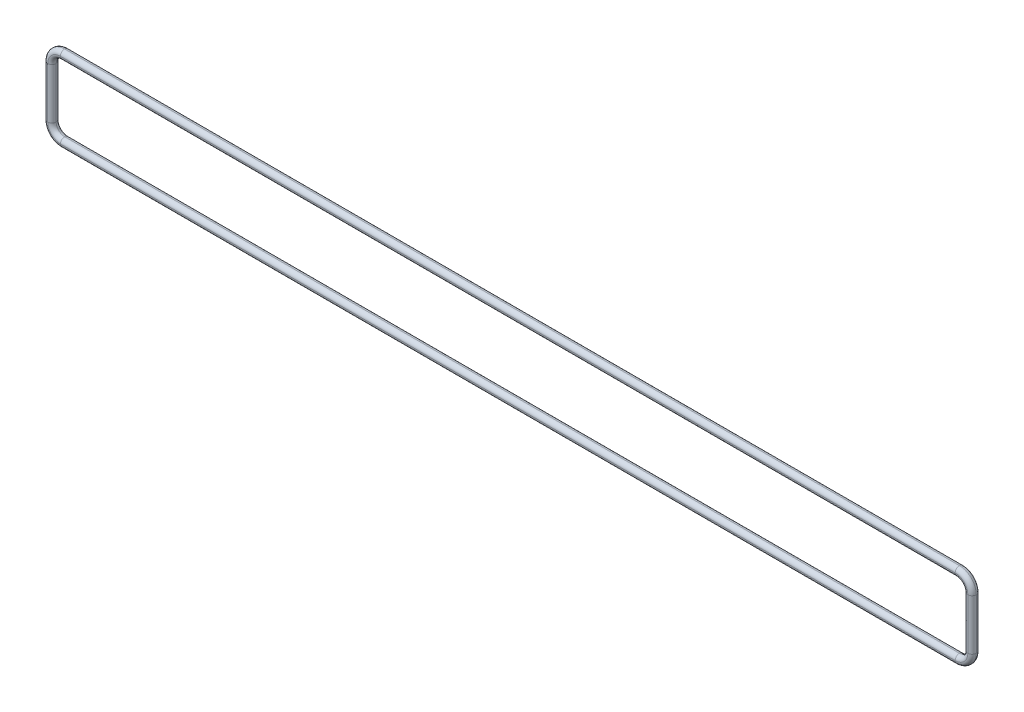
ISO-10303-21;
HEADER;
FILE_DESCRIPTION(('STEP AP214'),'2;1');
FILE_NAME('part.step','',(''),(''),'','','');
FILE_SCHEMA(('AUTOMOTIVE_DESIGN { 1 0 10303 214 1 1 1 1 }'));
ENDSEC;
DATA;
#1=APPLICATION_CONTEXT('core data for automotive mechanical design processes');
#2=APPLICATION_PROTOCOL_DEFINITION('international standard','automotive_design',2000,#1);
#3=PRODUCT_CONTEXT('',#1,'mechanical');
#4=PRODUCT('Part','Part','',(#3));
#5=PRODUCT_RELATED_PRODUCT_CATEGORY('part','',(#4));
#6=PRODUCT_DEFINITION_FORMATION('','',#4);
#7=PRODUCT_DEFINITION_CONTEXT('part definition',#1,'design');
#8=PRODUCT_DEFINITION('design','',#6,#7);
#9=PRODUCT_DEFINITION_SHAPE('','',#8);
#10=(LENGTH_UNIT() NAMED_UNIT(*) SI_UNIT(.MILLI.,.METRE.));
#11=(NAMED_UNIT(*) PLANE_ANGLE_UNIT() SI_UNIT($,.RADIAN.));
#12=(NAMED_UNIT(*) SI_UNIT($,.STERADIAN.) SOLID_ANGLE_UNIT());
#13=UNCERTAINTY_MEASURE_WITH_UNIT(LENGTH_MEASURE(1.E-05),#10,'distance_accuracy_value','');
#14=(GEOMETRIC_REPRESENTATION_CONTEXT(3) GLOBAL_UNCERTAINTY_ASSIGNED_CONTEXT((#13)) GLOBAL_UNIT_ASSIGNED_CONTEXT((#10,
#11,#12)) REPRESENTATION_CONTEXT('',''));
#15=CARTESIAN_POINT('',(0.,0.,0.));
#16=DIRECTION('',(0.,0.,1.));
#17=DIRECTION('',(1.,0.,0.));
#18=AXIS2_PLACEMENT_3D('',#15,#16,#17);
#19=CARTESIAN_POINT('',(695.325,0.,3.175));
#20=DIRECTION('',(0.,-1.,0.));
#21=DIRECTION('',(0.,0.,-1.));
#22=AXIS2_PLACEMENT_3D('',#19,#20,#21);
#23=CYLINDRICAL_SURFACE('',#22,3.175);
#24=CARTESIAN_POINT('',(695.325,38.1,3.175));
#25=DIRECTION('',(0.,1.,0.));
#26=DIRECTION('',(0.,0.,1.));
#27=AXIS2_PLACEMENT_3D('',#24,#25,#26);
#28=CIRCLE('',#27,3.175);
#29=CARTESIAN_POINT('',(695.325,38.1,0.));
#30=VERTEX_POINT('',#29);
#31=CARTESIAN_POINT('',(692.15,38.1,3.175));
#32=VERTEX_POINT('',#31);
#33=EDGE_CURVE('E11',#30,#32,#28,.T.);
#34=ORIENTED_EDGE('',*,*,#33,.F.);
#35=DIRECTION('',(0.,1.,0.));
#36=VECTOR('',#35,1.);
#37=CARTESIAN_POINT('',(695.325,38.1,0.));
#38=LINE('',#37,#36);
#39=CARTESIAN_POINT('',(695.325,0.,0.));
#40=VERTEX_POINT('',#39);
#41=EDGE_CURVE('E335',#40,#30,#38,.T.);
#42=ORIENTED_EDGE('',*,*,#41,.F.);
#43=CARTESIAN_POINT('',(695.325,0.,3.175));
#44=DIRECTION('',(0.,-1.,0.));
#45=DIRECTION('',(0.,0.,-1.));
#46=AXIS2_PLACEMENT_3D('',#43,#44,#45);
#47=CIRCLE('',#46,3.175);
#48=CARTESIAN_POINT('',(692.15,0.,3.175));
#49=VERTEX_POINT('',#48);
#50=EDGE_CURVE('E332',#49,#40,#47,.T.);
#51=ORIENTED_EDGE('',*,*,#50,.F.);
#52=DIRECTION('',(0.,1.,0.));
#53=VECTOR('',#52,1.);
#54=CARTESIAN_POINT('',(692.15,0.,3.175));
#55=LINE('',#54,#53);
#56=EDGE_CURVE('E44',#32,#49,#55,.F.);
#57=ORIENTED_EDGE('',*,*,#56,.F.);
#58=EDGE_LOOP('',(#34,#42,#51,#57));
#59=FACE_BOUND('',#58,.T.);
#60=ADVANCED_FACE('F37',(#59),#23,.T.);
#61=CARTESIAN_POINT('',(685.8,38.1,3.175));
#62=DIRECTION('',(0.,0.,1.));
#63=DIRECTION('',(1.,0.,0.));
#64=AXIS2_PLACEMENT_3D('',#61,#62,#63);
#65=TOROIDAL_SURFACE('',#64,9.52499999999993,3.175);
#66=CARTESIAN_POINT('',(685.8,38.1,0.));
#67=DIRECTION('',(0.,0.,1.));
#68=DIRECTION('',(1.,0.,0.));
#69=AXIS2_PLACEMENT_3D('',#66,#67,#68);
#70=CIRCLE('',#69,9.52499999999993);
#71=CARTESIAN_POINT('',(685.8,47.625,0.));
#72=VERTEX_POINT('',#71);
#73=EDGE_CURVE('E330',#30,#72,#70,.T.);
#74=ORIENTED_EDGE('',*,*,#73,.F.);
#75=ORIENTED_EDGE('',*,*,#33,.T.);
#76=CARTESIAN_POINT('',(685.8,38.1,3.175));
#77=DIRECTION('',(0.,0.,1.));
#78=DIRECTION('',(1.,0.,0.));
#79=AXIS2_PLACEMENT_3D('',#76,#77,#78);
#80=CIRCLE('',#79,6.34999999999993);
#81=CARTESIAN_POINT('',(685.8,44.45,3.175));
#82=VERTEX_POINT('',#81);
#83=EDGE_CURVE('E322',#82,#32,#80,.F.);
#84=ORIENTED_EDGE('',*,*,#83,.F.);
#85=CARTESIAN_POINT('',(685.8,47.6249999999999,3.175));
#86=DIRECTION('',(-1.,0.,0.));
#87=DIRECTION('',(0.,0.,1.));
#88=AXIS2_PLACEMENT_3D('',#85,#86,#87);
#89=CIRCLE('',#88,3.175);
#90=EDGE_CURVE('E319',#72,#82,#89,.T.);
#91=ORIENTED_EDGE('',*,*,#90,.F.);
#92=EDGE_LOOP('',(#74,#75,#84,#91));
#93=FACE_BOUND('',#92,.T.);
#94=ADVANCED_FACE('F422',(#93),#65,.T.);
#95=CARTESIAN_POINT('',(695.325,38.1,3.175));
#96=DIRECTION('',(0.,1.,0.));
#97=DIRECTION('',(0.,0.,1.));
#98=AXIS2_PLACEMENT_3D('',#95,#96,#97);
#99=CYLINDRICAL_SURFACE('',#98,3.175);
#100=CARTESIAN_POINT('',(695.325,38.1,3.175));
#101=DIRECTION('',(0.,1.,0.));
#102=DIRECTION('',(0.,0.,1.));
#103=AXIS2_PLACEMENT_3D('',#100,#101,#102);
#104=CIRCLE('',#103,3.175);
#105=CARTESIAN_POINT('',(695.325,38.1,6.35));
#106=VERTEX_POINT('',#105);
#107=EDGE_CURVE('E325',#32,#106,#104,.T.);
#108=ORIENTED_EDGE('',*,*,#107,.F.);
#109=ORIENTED_EDGE('',*,*,#56,.T.);
#110=CARTESIAN_POINT('',(695.325,0.,3.175));
#111=DIRECTION('',(0.,-1.,0.));
#112=DIRECTION('',(0.,0.,-1.));
#113=AXIS2_PLACEMENT_3D('',#110,#111,#112);
#114=CIRCLE('',#113,3.175);
#115=CARTESIAN_POINT('',(695.325,0.,6.35));
#116=VERTEX_POINT('',#115);
#117=EDGE_CURVE('E314',#116,#49,#114,.T.);
#118=ORIENTED_EDGE('',*,*,#117,.F.);
#119=DIRECTION('',(0.,1.,0.));
#120=VECTOR('',#119,1.);
#121=CARTESIAN_POINT('',(695.325,0.,6.35));
#122=LINE('',#121,#120);
#123=EDGE_CURVE('E311',#106,#116,#122,.F.);
#124=ORIENTED_EDGE('',*,*,#123,.F.);
#125=EDGE_LOOP('',(#108,#109,#118,#124));
#126=FACE_BOUND('',#125,.T.);
#127=ADVANCED_FACE('F339',(#126),#99,.T.);
#128=CARTESIAN_POINT('',(695.325,0.,3.175));
#129=DIRECTION('',(0.,1.,0.));
#130=DIRECTION('',(0.,0.,1.));
#131=AXIS2_PLACEMENT_3D('',#128,#129,#130);
#132=CYLINDRICAL_SURFACE('',#131,3.175);
#133=CARTESIAN_POINT('',(695.325,0.,3.175));
#134=DIRECTION('',(0.,-1.,0.));
#135=DIRECTION('',(0.,0.,-1.));
#136=AXIS2_PLACEMENT_3D('',#133,#134,#135);
#137=CIRCLE('',#136,3.175);
#138=CARTESIAN_POINT('',(698.5,0.,3.175));
#139=VERTEX_POINT('',#138);
#140=EDGE_CURVE('E305',#40,#139,#137,.T.);
#141=ORIENTED_EDGE('',*,*,#140,.F.);
#142=ORIENTED_EDGE('',*,*,#41,.T.);
#143=CARTESIAN_POINT('',(695.325,38.1,3.175));
#144=DIRECTION('',(0.,1.,0.));
#145=DIRECTION('',(0.,0.,1.));
#146=AXIS2_PLACEMENT_3D('',#143,#144,#145);
#147=CIRCLE('',#146,3.175);
#148=CARTESIAN_POINT('',(698.5,38.1,3.175));
#149=VERTEX_POINT('',#148);
#150=EDGE_CURVE('E327',#149,#30,#147,.T.);
#151=ORIENTED_EDGE('',*,*,#150,.F.);
#152=DIRECTION('',(0.,1.,0.));
#153=VECTOR('',#152,1.);
#154=CARTESIAN_POINT('',(698.5,0.,3.175));
#155=LINE('',#154,#153);
#156=EDGE_CURVE('E308',#139,#149,#155,.T.);
#157=ORIENTED_EDGE('',*,*,#156,.F.);
#158=EDGE_LOOP('',(#141,#142,#151,#157));
#159=FACE_BOUND('',#158,.T.);
#160=ADVANCED_FACE('F429',(#159),#132,.T.);
#161=CARTESIAN_POINT('',(685.8,0.,3.175));
#162=DIRECTION('',(0.,0.,1.));
#163=DIRECTION('',(1.,0.,0.));
#164=AXIS2_PLACEMENT_3D('',#161,#162,#163);
#165=TOROIDAL_SURFACE('',#164,9.52499999999993,3.175);
#166=CARTESIAN_POINT('',(685.8,0.,3.175));
#167=DIRECTION('',(0.,0.,1.));
#168=DIRECTION('',(1.,0.,0.));
#169=AXIS2_PLACEMENT_3D('',#166,#167,#168);
#170=CIRCLE('',#169,6.34999999999993);
#171=CARTESIAN_POINT('',(685.8,-6.35,3.175));
#172=VERTEX_POINT('',#171);
#173=EDGE_CURVE('E317',#49,#172,#170,.F.);
#174=ORIENTED_EDGE('',*,*,#173,.F.);
#175=ORIENTED_EDGE('',*,*,#50,.T.);
#176=CARTESIAN_POINT('',(685.8,0.,0.));
#177=DIRECTION('',(0.,0.,1.));
#178=DIRECTION('',(1.,0.,0.));
#179=AXIS2_PLACEMENT_3D('',#176,#177,#178);
#180=CIRCLE('',#179,9.52499999999993);
#181=CARTESIAN_POINT('',(685.8,-9.525,0.));
#182=VERTEX_POINT('',#181);
#183=EDGE_CURVE('E302',#182,#40,#180,.T.);
#184=ORIENTED_EDGE('',*,*,#183,.F.);
#185=CARTESIAN_POINT('',(685.8,-9.52499999999993,3.175));
#186=DIRECTION('',(-1.,0.,0.));
#187=DIRECTION('',(0.,0.,1.));
#188=AXIS2_PLACEMENT_3D('',#185,#186,#187);
#189=CIRCLE('',#188,3.175);
#190=EDGE_CURVE('E299',#172,#182,#189,.T.);
#191=ORIENTED_EDGE('',*,*,#190,.F.);
#192=EDGE_LOOP('',(#174,#175,#184,#191));
#193=FACE_BOUND('',#192,.T.);
#194=ADVANCED_FACE('F345',(#193),#165,.T.);
#195=CARTESIAN_POINT('',(685.8,38.1,3.175));
#196=DIRECTION('',(0.,0.,1.));
#197=DIRECTION('',(1.,0.,0.));
#198=AXIS2_PLACEMENT_3D('',#195,#196,#197);
#199=TOROIDAL_SURFACE('',#198,9.52499999999997,3.175);
#200=ORIENTED_EDGE('',*,*,#150,.T.);
#201=ORIENTED_EDGE('',*,*,#73,.T.);
#202=CARTESIAN_POINT('',(685.8,47.625,3.175));
#203=DIRECTION('',(-1.,0.,0.));
#204=DIRECTION('',(0.,0.,1.));
#205=AXIS2_PLACEMENT_3D('',#202,#203,#204);
#206=CIRCLE('',#205,3.175);
#207=CARTESIAN_POINT('',(685.8,50.8,3.175));
#208=VERTEX_POINT('',#207);
#209=EDGE_CURVE('E294',#208,#72,#206,.T.);
#210=ORIENTED_EDGE('',*,*,#209,.F.);
#211=CARTESIAN_POINT('',(685.8,38.1,3.175));
#212=DIRECTION('',(0.,0.,1.));
#213=DIRECTION('',(1.,0.,0.));
#214=AXIS2_PLACEMENT_3D('',#211,#212,#213);
#215=CIRCLE('',#214,12.7);
#216=EDGE_CURVE('E291',#149,#208,#215,.T.);
#217=ORIENTED_EDGE('',*,*,#216,.F.);
#218=EDGE_LOOP('',(#200,#201,#210,#217));
#219=FACE_BOUND('',#218,.T.);
#220=ADVANCED_FACE('F437',(#219),#199,.T.);
#221=CARTESIAN_POINT('',(685.8,38.1,3.175));
#222=DIRECTION('',(0.,0.,1.));
#223=DIRECTION('',(1.,0.,0.));
#224=AXIS2_PLACEMENT_3D('',#221,#222,#223);
#225=TOROIDAL_SURFACE('',#224,9.52499999999993,3.175);
#226=ORIENTED_EDGE('',*,*,#83,.T.);
#227=ORIENTED_EDGE('',*,*,#107,.T.);
#228=CARTESIAN_POINT('',(685.8,38.1,6.35));
#229=DIRECTION('',(0.,0.,1.));
#230=DIRECTION('',(1.,0.,0.));
#231=AXIS2_PLACEMENT_3D('',#228,#229,#230);
#232=CIRCLE('',#231,9.52499999999993);
#233=CARTESIAN_POINT('',(685.8,47.625,6.35));
#234=VERTEX_POINT('',#233);
#235=EDGE_CURVE('E285',#234,#106,#232,.F.);
#236=ORIENTED_EDGE('',*,*,#235,.F.);
#237=CARTESIAN_POINT('',(685.8,47.6249999999999,3.175));
#238=DIRECTION('',(-1.,0.,0.));
#239=DIRECTION('',(0.,0.,1.));
#240=AXIS2_PLACEMENT_3D('',#237,#238,#239);
#241=CIRCLE('',#240,3.175);
#242=EDGE_CURVE('E282',#82,#234,#241,.T.);
#243=ORIENTED_EDGE('',*,*,#242,.F.);
#244=EDGE_LOOP('',(#226,#227,#236,#243));
#245=FACE_BOUND('',#244,.T.);
#246=ADVANCED_FACE('F364',(#245),#225,.T.);
#247=CARTESIAN_POINT('',(12.7,47.625,3.175));
#248=DIRECTION('',(1.,0.,0.));
#249=DIRECTION('',(0.,0.,-1.));
#250=AXIS2_PLACEMENT_3D('',#247,#248,#249);
#251=CYLINDRICAL_SURFACE('',#250,3.175);
#252=DIRECTION('',(-1.,0.,0.));
#253=VECTOR('',#252,1.);
#254=CARTESIAN_POINT('',(12.7,47.625,0.));
#255=LINE('',#254,#253);
#256=CARTESIAN_POINT('',(12.7,47.625,0.));
#257=VERTEX_POINT('',#256);
#258=EDGE_CURVE('E297',#72,#257,#255,.T.);
#259=ORIENTED_EDGE('',*,*,#258,.F.);
#260=ORIENTED_EDGE('',*,*,#90,.T.);
#261=DIRECTION('',(-1.,0.,0.));
#262=VECTOR('',#261,1.);
#263=CARTESIAN_POINT('',(685.8,44.45,3.175));
#264=LINE('',#263,#262);
#265=CARTESIAN_POINT('',(12.7,44.45,3.175));
#266=VERTEX_POINT('',#265);
#267=EDGE_CURVE('E279',#266,#82,#264,.F.);
#268=ORIENTED_EDGE('',*,*,#267,.F.);
#269=CARTESIAN_POINT('',(12.7,47.625,3.175));
#270=DIRECTION('',(-1.,0.,0.));
#271=DIRECTION('',(0.,0.,1.));
#272=AXIS2_PLACEMENT_3D('',#269,#270,#271);
#273=CIRCLE('',#272,3.175);
#274=EDGE_CURVE('E276',#257,#266,#273,.T.);
#275=ORIENTED_EDGE('',*,*,#274,.F.);
#276=EDGE_LOOP('',(#259,#260,#268,#275));
#277=FACE_BOUND('',#276,.T.);
#278=ADVANCED_FACE('F371',(#277),#251,.T.);
#279=CARTESIAN_POINT('',(685.8,0.,3.175));
#280=DIRECTION('',(0.,0.,1.));
#281=DIRECTION('',(1.,0.,0.));
#282=AXIS2_PLACEMENT_3D('',#279,#280,#281);
#283=TOROIDAL_SURFACE('',#282,9.52499999999993,3.175);
#284=ORIENTED_EDGE('',*,*,#117,.T.);
#285=ORIENTED_EDGE('',*,*,#173,.T.);
#286=CARTESIAN_POINT('',(685.8,-9.52499999999993,3.175));
#287=DIRECTION('',(-1.,0.,0.));
#288=DIRECTION('',(0.,0.,1.));
#289=AXIS2_PLACEMENT_3D('',#286,#287,#288);
#290=CIRCLE('',#289,3.175);
#291=CARTESIAN_POINT('',(685.8,-9.525,6.35));
#292=VERTEX_POINT('',#291);
#293=EDGE_CURVE('E271',#292,#172,#290,.T.);
#294=ORIENTED_EDGE('',*,*,#293,.F.);
#295=CARTESIAN_POINT('',(685.8,0.,6.35));
#296=DIRECTION('',(0.,0.,1.));
#297=DIRECTION('',(1.,0.,0.));
#298=AXIS2_PLACEMENT_3D('',#295,#296,#297);
#299=CIRCLE('',#298,9.52499999999993);
#300=EDGE_CURVE('E268',#116,#292,#299,.F.);
#301=ORIENTED_EDGE('',*,*,#300,.F.);
#302=EDGE_LOOP('',(#284,#285,#294,#301));
#303=FACE_BOUND('',#302,.T.);
#304=ADVANCED_FACE('F349',(#303),#283,.T.);
#305=CARTESIAN_POINT('',(695.325,0.,3.175));
#306=DIRECTION('',(0.,-1.,0.));
#307=DIRECTION('',(0.,0.,-1.));
#308=AXIS2_PLACEMENT_3D('',#305,#306,#307);
#309=CYLINDRICAL_SURFACE('',#308,3.175);
#310=CARTESIAN_POINT('',(695.325,38.1,3.175));
#311=DIRECTION('',(0.,1.,0.));
#312=DIRECTION('',(0.,0.,1.));
#313=AXIS2_PLACEMENT_3D('',#310,#311,#312);
#314=CIRCLE('',#313,3.175);
#315=EDGE_CURVE('E288',#106,#149,#314,.T.);
#316=ORIENTED_EDGE('',*,*,#315,.F.);
#317=ORIENTED_EDGE('',*,*,#123,.T.);
#318=CARTESIAN_POINT('',(695.325,0.,3.175));
#319=DIRECTION('',(0.,-1.,0.));
#320=DIRECTION('',(0.,0.,-1.));
#321=AXIS2_PLACEMENT_3D('',#318,#319,#320);
#322=CIRCLE('',#321,3.175);
#323=EDGE_CURVE('E265',#139,#116,#322,.T.);
#324=ORIENTED_EDGE('',*,*,#323,.F.);
#325=ORIENTED_EDGE('',*,*,#156,.T.);
#326=EDGE_LOOP('',(#316,#317,#324,#325));
#327=FACE_BOUND('',#326,.T.);
#328=ADVANCED_FACE('F357',(#327),#309,.T.);
#329=CARTESIAN_POINT('',(685.8,0.,3.175));
#330=DIRECTION('',(0.,0.,1.));
#331=DIRECTION('',(1.,0.,0.));
#332=AXIS2_PLACEMENT_3D('',#329,#330,#331);
#333=TOROIDAL_SURFACE('',#332,9.52499999999997,3.175);
#334=ORIENTED_EDGE('',*,*,#183,.T.);
#335=ORIENTED_EDGE('',*,*,#140,.T.);
#336=CARTESIAN_POINT('',(685.8,0.,3.175));
#337=DIRECTION('',(0.,0.,1.));
#338=DIRECTION('',(1.,0.,0.));
#339=AXIS2_PLACEMENT_3D('',#336,#337,#338);
#340=CIRCLE('',#339,12.7);
#341=CARTESIAN_POINT('',(685.8,-12.7,3.175));
#342=VERTEX_POINT('',#341);
#343=EDGE_CURVE('E262',#342,#139,#340,.T.);
#344=ORIENTED_EDGE('',*,*,#343,.F.);
#345=CARTESIAN_POINT('',(685.8,-9.52499999999997,3.175));
#346=DIRECTION('',(-1.,0.,0.));
#347=DIRECTION('',(0.,0.,1.));
#348=AXIS2_PLACEMENT_3D('',#345,#346,#347);
#349=CIRCLE('',#348,3.175);
#350=EDGE_CURVE('E259',#182,#342,#349,.T.);
#351=ORIENTED_EDGE('',*,*,#350,.F.);
#352=EDGE_LOOP('',(#334,#335,#344,#351));
#353=FACE_BOUND('',#352,.T.);
#354=ADVANCED_FACE('F449',(#353),#333,.T.);
#355=CARTESIAN_POINT('',(12.7,47.625,3.175));
#356=DIRECTION('',(-1.,0.,0.));
#357=DIRECTION('',(0.,0.,1.));
#358=AXIS2_PLACEMENT_3D('',#355,#356,#357);
#359=CYLINDRICAL_SURFACE('',#358,3.175);
#360=ORIENTED_EDGE('',*,*,#209,.T.);
#361=ORIENTED_EDGE('',*,*,#258,.T.);
#362=CARTESIAN_POINT('',(12.7,47.625,3.175));
#363=DIRECTION('',(-1.,0.,0.));
#364=DIRECTION('',(0.,0.,1.));
#365=AXIS2_PLACEMENT_3D('',#362,#363,#364);
#366=CIRCLE('',#365,3.175);
#367=CARTESIAN_POINT('',(12.7,50.8,3.175));
#368=VERTEX_POINT('',#367);
#369=EDGE_CURVE('E248',#368,#257,#366,.T.);
#370=ORIENTED_EDGE('',*,*,#369,.F.);
#371=DIRECTION('',(-1.,0.,0.));
#372=VECTOR('',#371,1.);
#373=CARTESIAN_POINT('',(12.7,50.8,3.175));
#374=LINE('',#373,#372);
#375=EDGE_CURVE('E245',#208,#368,#374,.T.);
#376=ORIENTED_EDGE('',*,*,#375,.F.);
#377=EDGE_LOOP('',(#360,#361,#370,#376));
#378=FACE_BOUND('',#377,.T.);
#379=ADVANCED_FACE('F383',(#378),#359,.T.);
#380=CARTESIAN_POINT('',(685.8,38.1,3.175));
#381=DIRECTION('',(0.,0.,1.));
#382=DIRECTION('',(1.,0.,0.));
#383=AXIS2_PLACEMENT_3D('',#380,#381,#382);
#384=TOROIDAL_SURFACE('',#383,9.52499999999997,3.175);
#385=ORIENTED_EDGE('',*,*,#315,.T.);
#386=ORIENTED_EDGE('',*,*,#216,.T.);
#387=CARTESIAN_POINT('',(685.8,47.625,3.175));
#388=DIRECTION('',(-1.,0.,0.));
#389=DIRECTION('',(0.,0.,1.));
#390=AXIS2_PLACEMENT_3D('',#387,#388,#389);
#391=CIRCLE('',#390,3.175);
#392=EDGE_CURVE('E242',#234,#208,#391,.T.);
#393=ORIENTED_EDGE('',*,*,#392,.F.);
#394=ORIENTED_EDGE('',*,*,#235,.T.);
#395=EDGE_LOOP('',(#385,#386,#393,#394));
#396=FACE_BOUND('',#395,.T.);
#397=ADVANCED_FACE('F361',(#396),#384,.T.);
#398=CARTESIAN_POINT('',(12.7,47.625,3.175));
#399=DIRECTION('',(-1.,0.,0.));
#400=DIRECTION('',(0.,0.,1.));
#401=AXIS2_PLACEMENT_3D('',#398,#399,#400);
#402=CYLINDRICAL_SURFACE('',#401,3.175);
#403=ORIENTED_EDGE('',*,*,#267,.T.);
#404=ORIENTED_EDGE('',*,*,#242,.T.);
#405=DIRECTION('',(-1.,0.,0.));
#406=VECTOR('',#405,1.);
#407=CARTESIAN_POINT('',(12.7,47.625,6.35));
#408=LINE('',#407,#406);
#409=CARTESIAN_POINT('',(12.7,47.625,6.35));
#410=VERTEX_POINT('',#409);
#411=EDGE_CURVE('E239',#410,#234,#408,.F.);
#412=ORIENTED_EDGE('',*,*,#411,.F.);
#413=CARTESIAN_POINT('',(12.7,47.625,3.175));
#414=DIRECTION('',(-1.,0.,0.));
#415=DIRECTION('',(0.,0.,1.));
#416=AXIS2_PLACEMENT_3D('',#413,#414,#415);
#417=CIRCLE('',#416,3.175);
#418=EDGE_CURVE('E236',#266,#410,#417,.T.);
#419=ORIENTED_EDGE('',*,*,#418,.F.);
#420=EDGE_LOOP('',(#403,#404,#412,#419));
#421=FACE_BOUND('',#420,.T.);
#422=ADVANCED_FACE('F366',(#421),#402,.T.);
#423=CARTESIAN_POINT('',(12.7,-9.525,3.175));
#424=DIRECTION('',(-1.,0.,0.));
#425=DIRECTION('',(0.,0.,1.));
#426=AXIS2_PLACEMENT_3D('',#423,#424,#425);
#427=CYLINDRICAL_SURFACE('',#426,3.175);
#428=DIRECTION('',(1.,0.,0.));
#429=VECTOR('',#428,1.);
#430=CARTESIAN_POINT('',(12.7,-6.35,3.175));
#431=LINE('',#430,#429);
#432=CARTESIAN_POINT('',(12.7,-6.35,3.175));
#433=VERTEX_POINT('',#432);
#434=EDGE_CURVE('E274',#172,#433,#431,.F.);
#435=ORIENTED_EDGE('',*,*,#434,.F.);
#436=ORIENTED_EDGE('',*,*,#190,.T.);
#437=DIRECTION('',(1.,0.,0.));
#438=VECTOR('',#437,1.);
#439=CARTESIAN_POINT('',(685.8,-9.525,0.));
#440=LINE('',#439,#438);
#441=CARTESIAN_POINT('',(12.7,-9.525,0.));
#442=VERTEX_POINT('',#441);
#443=EDGE_CURVE('E256',#442,#182,#440,.T.);
#444=ORIENTED_EDGE('',*,*,#443,.F.);
#445=CARTESIAN_POINT('',(12.7,-9.525,3.175));
#446=DIRECTION('',(-1.,0.,0.));
#447=DIRECTION('',(0.,0.,1.));
#448=AXIS2_PLACEMENT_3D('',#445,#446,#447);
#449=CIRCLE('',#448,3.175);
#450=EDGE_CURVE('E253',#433,#442,#449,.T.);
#451=ORIENTED_EDGE('',*,*,#450,.F.);
#452=EDGE_LOOP('',(#435,#436,#444,#451));
#453=FACE_BOUND('',#452,.T.);
#454=ADVANCED_FACE('F408',(#453),#427,.T.);
#455=CARTESIAN_POINT('',(12.7,-9.525,3.175));
#456=DIRECTION('',(1.,0.,0.));
#457=DIRECTION('',(0.,0.,-1.));
#458=AXIS2_PLACEMENT_3D('',#455,#456,#457);
#459=CYLINDRICAL_SURFACE('',#458,3.175);
#460=ORIENTED_EDGE('',*,*,#293,.T.);
#461=ORIENTED_EDGE('',*,*,#434,.T.);
#462=CARTESIAN_POINT('',(12.7,-9.525,3.175));
#463=DIRECTION('',(-1.,0.,0.));
#464=DIRECTION('',(0.,0.,1.));
#465=AXIS2_PLACEMENT_3D('',#462,#463,#464);
#466=CIRCLE('',#465,3.175);
#467=CARTESIAN_POINT('',(12.7,-9.525,6.35));
#468=VERTEX_POINT('',#467);
#469=EDGE_CURVE('E225',#468,#433,#466,.T.);
#470=ORIENTED_EDGE('',*,*,#469,.F.);
#471=DIRECTION('',(1.,0.,0.));
#472=VECTOR('',#471,1.);
#473=CARTESIAN_POINT('',(12.7,-9.525,6.35));
#474=LINE('',#473,#472);
#475=EDGE_CURVE('E222',#292,#468,#474,.F.);
#476=ORIENTED_EDGE('',*,*,#475,.F.);
#477=EDGE_LOOP('',(#460,#461,#470,#476));
#478=FACE_BOUND('',#477,.T.);
#479=ADVANCED_FACE('F405',(#478),#459,.T.);
#480=CARTESIAN_POINT('',(685.8,0.,3.175));
#481=DIRECTION('',(0.,0.,1.));
#482=DIRECTION('',(1.,0.,0.));
#483=AXIS2_PLACEMENT_3D('',#480,#481,#482);
#484=TOROIDAL_SURFACE('',#483,9.52499999999997,3.175);
#485=ORIENTED_EDGE('',*,*,#323,.T.);
#486=ORIENTED_EDGE('',*,*,#300,.T.);
#487=CARTESIAN_POINT('',(685.8,-9.52499999999997,3.175));
#488=DIRECTION('',(-1.,0.,0.));
#489=DIRECTION('',(0.,0.,1.));
#490=AXIS2_PLACEMENT_3D('',#487,#488,#489);
#491=CIRCLE('',#490,3.175);
#492=EDGE_CURVE('E219',#342,#292,#491,.T.);
#493=ORIENTED_EDGE('',*,*,#492,.F.);
#494=ORIENTED_EDGE('',*,*,#343,.T.);
#495=EDGE_LOOP('',(#485,#486,#493,#494));
#496=FACE_BOUND('',#495,.T.);
#497=ADVANCED_FACE('F354',(#496),#484,.T.);
#498=CARTESIAN_POINT('',(12.7,-9.525,3.175));
#499=DIRECTION('',(1.,0.,0.));
#500=DIRECTION('',(0.,0.,-1.));
#501=AXIS2_PLACEMENT_3D('',#498,#499,#500);
#502=CYLINDRICAL_SURFACE('',#501,3.175);
#503=ORIENTED_EDGE('',*,*,#443,.T.);
#504=ORIENTED_EDGE('',*,*,#350,.T.);
#505=DIRECTION('',(1.,0.,0.));
#506=VECTOR('',#505,1.);
#507=CARTESIAN_POINT('',(12.7,-12.7,3.175));
#508=LINE('',#507,#506);
#509=CARTESIAN_POINT('',(12.7,-12.7,3.175));
#510=VERTEX_POINT('',#509);
#511=EDGE_CURVE('E216',#510,#342,#508,.T.);
#512=ORIENTED_EDGE('',*,*,#511,.F.);
#513=CARTESIAN_POINT('',(12.7,-9.525,3.175));
#514=DIRECTION('',(-1.,0.,0.));
#515=DIRECTION('',(0.,0.,1.));
#516=AXIS2_PLACEMENT_3D('',#513,#514,#515);
#517=CIRCLE('',#516,3.175);
#518=EDGE_CURVE('E213',#442,#510,#517,.T.);
#519=ORIENTED_EDGE('',*,*,#518,.F.);
#520=EDGE_LOOP('',(#503,#504,#512,#519));
#521=FACE_BOUND('',#520,.T.);
#522=ADVANCED_FACE('F463',(#521),#502,.T.);
#523=CARTESIAN_POINT('',(12.7,38.1,3.175));
#524=DIRECTION('',(0.,0.,1.));
#525=DIRECTION('',(1.,0.,0.));
#526=AXIS2_PLACEMENT_3D('',#523,#524,#525);
#527=TOROIDAL_SURFACE('',#526,9.525,3.175);
#528=CARTESIAN_POINT('',(12.7,38.1,0.));
#529=DIRECTION('',(0.,0.,1.));
#530=DIRECTION('',(1.,0.,0.));
#531=AXIS2_PLACEMENT_3D('',#528,#529,#530);
#532=CIRCLE('',#531,9.525);
#533=CARTESIAN_POINT('',(3.175,38.1,0.));
#534=VERTEX_POINT('',#533);
#535=EDGE_CURVE('E251',#257,#534,#532,.T.);
#536=ORIENTED_EDGE('',*,*,#535,.F.);
#537=ORIENTED_EDGE('',*,*,#274,.T.);
#538=CARTESIAN_POINT('',(12.7,38.1,3.175));
#539=DIRECTION('',(0.,0.,1.));
#540=DIRECTION('',(1.,0.,0.));
#541=AXIS2_PLACEMENT_3D('',#538,#539,#540);
#542=CIRCLE('',#541,6.35);
#543=CARTESIAN_POINT('',(6.35,38.1,3.175));
#544=VERTEX_POINT('',#543);
#545=EDGE_CURVE('E233',#544,#266,#542,.F.);
#546=ORIENTED_EDGE('',*,*,#545,.F.);
#547=CARTESIAN_POINT('',(3.175,38.1,3.175));
#548=DIRECTION('',(0.,-1.,0.));
#549=DIRECTION('',(0.,0.,-1.));
#550=AXIS2_PLACEMENT_3D('',#547,#548,#549);
#551=CIRCLE('',#550,3.175);
#552=EDGE_CURVE('E230',#534,#544,#551,.T.);
#553=ORIENTED_EDGE('',*,*,#552,.F.);
#554=EDGE_LOOP('',(#536,#537,#546,#553));
#555=FACE_BOUND('',#554,.T.);
#556=ADVANCED_FACE('F375',(#555),#527,.T.);
#557=CARTESIAN_POINT('',(12.7,38.1,3.175));
#558=DIRECTION('',(0.,0.,1.));
#559=DIRECTION('',(1.,0.,0.));
#560=AXIS2_PLACEMENT_3D('',#557,#558,#559);
#561=TOROIDAL_SURFACE('',#560,9.525,3.175);
#562=ORIENTED_EDGE('',*,*,#369,.T.);
#563=ORIENTED_EDGE('',*,*,#535,.T.);
#564=CARTESIAN_POINT('',(3.175,38.1,3.175));
#565=DIRECTION('',(0.,-1.,0.));
#566=DIRECTION('',(0.,0.,-1.));
#567=AXIS2_PLACEMENT_3D('',#564,#565,#566);
#568=CIRCLE('',#567,3.175);
#569=CARTESIAN_POINT('',(0.,38.1,3.175));
#570=VERTEX_POINT('',#569);
#571=EDGE_CURVE('E202',#570,#534,#568,.T.);
#572=ORIENTED_EDGE('',*,*,#571,.F.);
#573=CARTESIAN_POINT('',(12.7,38.1,3.175));
#574=DIRECTION('',(0.,0.,1.));
#575=DIRECTION('',(1.,0.,0.));
#576=AXIS2_PLACEMENT_3D('',#573,#574,#575);
#577=CIRCLE('',#576,12.7);
#578=EDGE_CURVE('E199',#368,#570,#577,.T.);
#579=ORIENTED_EDGE('',*,*,#578,.F.);
#580=EDGE_LOOP('',(#562,#563,#572,#579));
#581=FACE_BOUND('',#580,.T.);
#582=ADVANCED_FACE('F380',(#581),#561,.T.);
#583=CARTESIAN_POINT('',(12.7,47.625,3.175));
#584=DIRECTION('',(1.,0.,0.));
#585=DIRECTION('',(0.,0.,-1.));
#586=AXIS2_PLACEMENT_3D('',#583,#584,#585);
#587=CYLINDRICAL_SURFACE('',#586,3.175);
#588=ORIENTED_EDGE('',*,*,#392,.T.);
#589=ORIENTED_EDGE('',*,*,#375,.T.);
#590=CARTESIAN_POINT('',(12.7,47.625,3.175));
#591=DIRECTION('',(-1.,0.,0.));
#592=DIRECTION('',(0.,0.,1.));
#593=AXIS2_PLACEMENT_3D('',#590,#591,#592);
#594=CIRCLE('',#593,3.175);
#595=EDGE_CURVE('E196',#410,#368,#594,.T.);
#596=ORIENTED_EDGE('',*,*,#595,.F.);
#597=ORIENTED_EDGE('',*,*,#411,.T.);
#598=EDGE_LOOP('',(#588,#589,#596,#597));
#599=FACE_BOUND('',#598,.T.);
#600=ADVANCED_FACE('F386',(#599),#587,.T.);
#601=CARTESIAN_POINT('',(12.7,38.1,3.175));
#602=DIRECTION('',(0.,0.,1.));
#603=DIRECTION('',(1.,0.,0.));
#604=AXIS2_PLACEMENT_3D('',#601,#602,#603);
#605=TOROIDAL_SURFACE('',#604,9.525,3.175);
#606=ORIENTED_EDGE('',*,*,#545,.T.);
#607=ORIENTED_EDGE('',*,*,#418,.T.);
#608=CARTESIAN_POINT('',(12.7,38.1,6.35));
#609=DIRECTION('',(0.,0.,1.));
#610=DIRECTION('',(1.,0.,0.));
#611=AXIS2_PLACEMENT_3D('',#608,#609,#610);
#612=CIRCLE('',#611,9.525);
#613=CARTESIAN_POINT('',(3.175,38.1,6.35));
#614=VERTEX_POINT('',#613);
#615=EDGE_CURVE('E193',#614,#410,#612,.F.);
#616=ORIENTED_EDGE('',*,*,#615,.F.);
#617=CARTESIAN_POINT('',(3.175,38.1,3.175));
#618=DIRECTION('',(0.,-1.,0.));
#619=DIRECTION('',(0.,0.,-1.));
#620=AXIS2_PLACEMENT_3D('',#617,#618,#619);
#621=CIRCLE('',#620,3.175);
#622=EDGE_CURVE('E174',#544,#614,#621,.T.);
#623=ORIENTED_EDGE('',*,*,#622,.F.);
#624=EDGE_LOOP('',(#606,#607,#616,#623));
#625=FACE_BOUND('',#624,.T.);
#626=ADVANCED_FACE('F390',(#625),#605,.T.);
#627=CARTESIAN_POINT('',(12.7,0.,3.175));
#628=DIRECTION('',(0.,0.,1.));
#629=DIRECTION('',(1.,0.,0.));
#630=AXIS2_PLACEMENT_3D('',#627,#628,#629);
#631=TOROIDAL_SURFACE('',#630,9.525,3.175);
#632=CARTESIAN_POINT('',(3.17500000000001,0.,3.175));
#633=DIRECTION('',(0.,1.,0.));
#634=DIRECTION('',(-1.,0.,0.));
#635=AXIS2_PLACEMENT_3D('',#632,#633,#634);
#636=CIRCLE('',#635,3.175);
#637=CARTESIAN_POINT('',(6.35,0.,3.175));
#638=VERTEX_POINT('',#637);
#639=CARTESIAN_POINT('',(3.175,0.,0.));
#640=VERTEX_POINT('',#639);
#641=EDGE_CURVE('E228',#638,#640,#636,.T.);
#642=ORIENTED_EDGE('',*,*,#641,.F.);
#643=CARTESIAN_POINT('',(12.7,0.,3.175));
#644=DIRECTION('',(0.,0.,1.));
#645=DIRECTION('',(1.,0.,0.));
#646=AXIS2_PLACEMENT_3D('',#643,#644,#645);
#647=CIRCLE('',#646,6.35);
#648=EDGE_CURVE('E153',#433,#638,#647,.F.);
#649=ORIENTED_EDGE('',*,*,#648,.F.);
#650=ORIENTED_EDGE('',*,*,#450,.T.);
#651=CARTESIAN_POINT('',(12.7,0.,0.));
#652=DIRECTION('',(0.,0.,1.));
#653=DIRECTION('',(1.,0.,0.));
#654=AXIS2_PLACEMENT_3D('',#651,#652,#653);
#655=CIRCLE('',#654,9.525);
#656=EDGE_CURVE('E210',#640,#442,#655,.T.);
#657=ORIENTED_EDGE('',*,*,#656,.F.);
#658=EDGE_LOOP('',(#642,#649,#650,#657));
#659=FACE_BOUND('',#658,.T.);
#660=ADVANCED_FACE('F410',(#659),#631,.T.);
#661=CARTESIAN_POINT('',(3.17500000000001,0.,3.175));
#662=DIRECTION('',(0.,1.,0.));
#663=DIRECTION('',(-1.,0.,0.));
#664=AXIS2_PLACEMENT_3D('',#661,#662,#663);
#665=CYLINDRICAL_SURFACE('',#664,3.175);
#666=DIRECTION('',(0.,-1.,0.));
#667=VECTOR('',#666,1.);
#668=CARTESIAN_POINT('',(6.35,38.1,3.175));
#669=LINE('',#668,#667);
#670=EDGE_CURVE('E158',#638,#544,#669,.F.);
#671=ORIENTED_EDGE('',*,*,#670,.F.);
#672=ORIENTED_EDGE('',*,*,#641,.T.);
#673=DIRECTION('',(0.,-1.,0.));
#674=VECTOR('',#673,1.);
#675=CARTESIAN_POINT('',(3.17500000000001,0.,0.));
#676=LINE('',#675,#674);
#677=EDGE_CURVE('E205',#534,#640,#676,.T.);
#678=ORIENTED_EDGE('',*,*,#677,.F.);
#679=ORIENTED_EDGE('',*,*,#552,.T.);
#680=EDGE_LOOP('',(#671,#672,#678,#679));
#681=FACE_BOUND('',#680,.T.);
#682=ADVANCED_FACE('F392',(#681),#665,.T.);
#683=CARTESIAN_POINT('',(12.7,0.,3.175));
#684=DIRECTION('',(0.,0.,1.));
#685=DIRECTION('',(1.,0.,0.));
#686=AXIS2_PLACEMENT_3D('',#683,#684,#685);
#687=TOROIDAL_SURFACE('',#686,9.525,3.175);
#688=ORIENTED_EDGE('',*,*,#469,.T.);
#689=ORIENTED_EDGE('',*,*,#648,.T.);
#690=CARTESIAN_POINT('',(3.17500000000001,0.,3.175));
#691=DIRECTION('',(0.,1.,0.));
#692=DIRECTION('',(-1.,0.,0.));
#693=AXIS2_PLACEMENT_3D('',#690,#691,#692);
#694=CIRCLE('',#693,3.175);
#695=CARTESIAN_POINT('',(3.175,0.,6.35));
#696=VERTEX_POINT('',#695);
#697=EDGE_CURVE('E146',#696,#638,#694,.T.);
#698=ORIENTED_EDGE('',*,*,#697,.F.);
#699=CARTESIAN_POINT('',(12.7,0.,6.35));
#700=DIRECTION('',(0.,0.,1.));
#701=DIRECTION('',(1.,0.,0.));
#702=AXIS2_PLACEMENT_3D('',#699,#700,#701);
#703=CIRCLE('',#702,9.525);
#704=EDGE_CURVE('E150',#468,#696,#703,.F.);
#705=ORIENTED_EDGE('',*,*,#704,.F.);
#706=EDGE_LOOP('',(#688,#689,#698,#705));
#707=FACE_BOUND('',#706,.T.);
#708=ADVANCED_FACE('F149',(#707),#687,.T.);
#709=CARTESIAN_POINT('',(12.7,-9.525,3.175));
#710=DIRECTION('',(-1.,0.,0.));
#711=DIRECTION('',(0.,0.,1.));
#712=AXIS2_PLACEMENT_3D('',#709,#710,#711);
#713=CYLINDRICAL_SURFACE('',#712,3.175);
#714=ORIENTED_EDGE('',*,*,#492,.T.);
#715=ORIENTED_EDGE('',*,*,#475,.T.);
#716=CARTESIAN_POINT('',(12.7,-9.525,3.175));
#717=DIRECTION('',(-1.,0.,0.));
#718=DIRECTION('',(0.,0.,1.));
#719=AXIS2_PLACEMENT_3D('',#716,#717,#718);
#720=CIRCLE('',#719,3.175);
#721=EDGE_CURVE('E167',#510,#468,#720,.T.);
#722=ORIENTED_EDGE('',*,*,#721,.F.);
#723=ORIENTED_EDGE('',*,*,#511,.T.);
#724=EDGE_LOOP('',(#714,#715,#722,#723));
#725=FACE_BOUND('',#724,.T.);
#726=ADVANCED_FACE('F403',(#725),#713,.T.);
#727=CARTESIAN_POINT('',(12.7,0.,3.175));
#728=DIRECTION('',(0.,0.,1.));
#729=DIRECTION('',(1.,0.,0.));
#730=AXIS2_PLACEMENT_3D('',#727,#728,#729);
#731=TOROIDAL_SURFACE('',#730,9.525,3.175);
#732=CARTESIAN_POINT('',(3.175,0.,3.175));
#733=DIRECTION('',(0.,1.,0.));
#734=DIRECTION('',(0.,0.,1.));
#735=AXIS2_PLACEMENT_3D('',#732,#733,#734);
#736=CIRCLE('',#735,3.175);
#737=CARTESIAN_POINT('',(0.,0.,3.175));
#738=VERTEX_POINT('',#737);
#739=EDGE_CURVE('E208',#640,#738,#736,.T.);
#740=ORIENTED_EDGE('',*,*,#739,.F.);
#741=ORIENTED_EDGE('',*,*,#656,.T.);
#742=ORIENTED_EDGE('',*,*,#518,.T.);
#743=CARTESIAN_POINT('',(12.7,0.,3.175));
#744=DIRECTION('',(0.,0.,1.));
#745=DIRECTION('',(1.,0.,0.));
#746=AXIS2_PLACEMENT_3D('',#743,#744,#745);
#747=CIRCLE('',#746,12.7);
#748=EDGE_CURVE('E188',#738,#510,#747,.T.);
#749=ORIENTED_EDGE('',*,*,#748,.F.);
#750=EDGE_LOOP('',(#740,#741,#742,#749));
#751=FACE_BOUND('',#750,.T.);
#752=ADVANCED_FACE('F399',(#751),#731,.T.);
#753=CARTESIAN_POINT('',(3.175,0.,3.175));
#754=DIRECTION('',(0.,-1.,0.));
#755=DIRECTION('',(0.,0.,-1.));
#756=AXIS2_PLACEMENT_3D('',#753,#754,#755);
#757=CYLINDRICAL_SURFACE('',#756,3.175);
#758=ORIENTED_EDGE('',*,*,#677,.T.);
#759=ORIENTED_EDGE('',*,*,#739,.T.);
#760=DIRECTION('',(0.,-1.,0.));
#761=VECTOR('',#760,1.);
#762=CARTESIAN_POINT('',(0.,0.,3.175));
#763=LINE('',#762,#761);
#764=EDGE_CURVE('E183',#570,#738,#763,.T.);
#765=ORIENTED_EDGE('',*,*,#764,.F.);
#766=ORIENTED_EDGE('',*,*,#571,.T.);
#767=EDGE_LOOP('',(#758,#759,#765,#766));
#768=FACE_BOUND('',#767,.T.);
#769=ADVANCED_FACE('F395',(#768),#757,.T.);
#770=CARTESIAN_POINT('',(12.7,38.1,3.175));
#771=DIRECTION('',(0.,0.,1.));
#772=DIRECTION('',(1.,0.,0.));
#773=AXIS2_PLACEMENT_3D('',#770,#771,#772);
#774=TOROIDAL_SURFACE('',#773,9.525,3.175);
#775=ORIENTED_EDGE('',*,*,#595,.T.);
#776=ORIENTED_EDGE('',*,*,#578,.T.);
#777=CARTESIAN_POINT('',(3.175,38.1,3.175));
#778=DIRECTION('',(0.,-1.,0.));
#779=DIRECTION('',(0.,0.,-1.));
#780=AXIS2_PLACEMENT_3D('',#777,#778,#779);
#781=CIRCLE('',#780,3.175);
#782=EDGE_CURVE('E178',#614,#570,#781,.T.);
#783=ORIENTED_EDGE('',*,*,#782,.F.);
#784=ORIENTED_EDGE('',*,*,#615,.T.);
#785=EDGE_LOOP('',(#775,#776,#783,#784));
#786=FACE_BOUND('',#785,.T.);
#787=ADVANCED_FACE('F388',(#786),#774,.T.);
#788=CARTESIAN_POINT('',(3.175,38.1,3.175));
#789=DIRECTION('',(0.,-1.,0.));
#790=DIRECTION('',(1.,0.,0.));
#791=AXIS2_PLACEMENT_3D('',#788,#789,#790);
#792=CYLINDRICAL_SURFACE('',#791,3.175);
#793=ORIENTED_EDGE('',*,*,#670,.T.);
#794=ORIENTED_EDGE('',*,*,#622,.T.);
#795=DIRECTION('',(0.,-1.,0.));
#796=VECTOR('',#795,1.);
#797=CARTESIAN_POINT('',(3.17500000000001,0.,6.35));
#798=LINE('',#797,#796);
#799=EDGE_CURVE('E171',#696,#614,#798,.F.);
#800=ORIENTED_EDGE('',*,*,#799,.F.);
#801=ORIENTED_EDGE('',*,*,#697,.T.);
#802=EDGE_LOOP('',(#793,#794,#800,#801));
#803=FACE_BOUND('',#802,.T.);
#804=ADVANCED_FACE('F172',(#803),#792,.T.);
#805=CARTESIAN_POINT('',(12.7,0.,3.175));
#806=DIRECTION('',(0.,0.,1.));
#807=DIRECTION('',(1.,0.,0.));
#808=AXIS2_PLACEMENT_3D('',#805,#806,#807);
#809=TOROIDAL_SURFACE('',#808,9.525,3.175);
#810=ORIENTED_EDGE('',*,*,#721,.T.);
#811=ORIENTED_EDGE('',*,*,#704,.T.);
#812=CARTESIAN_POINT('',(3.175,0.,3.175));
#813=DIRECTION('',(0.,1.,0.));
#814=DIRECTION('',(0.,0.,1.));
#815=AXIS2_PLACEMENT_3D('',#812,#813,#814);
#816=CIRCLE('',#815,3.175);
#817=EDGE_CURVE('E165',#738,#696,#816,.T.);
#818=ORIENTED_EDGE('',*,*,#817,.F.);
#819=ORIENTED_EDGE('',*,*,#748,.T.);
#820=EDGE_LOOP('',(#810,#811,#818,#819));
#821=FACE_BOUND('',#820,.T.);
#822=ADVANCED_FACE('F162',(#821),#809,.T.);
#823=CARTESIAN_POINT('',(3.175,0.,3.175));
#824=DIRECTION('',(0.,1.,0.));
#825=DIRECTION('',(0.,0.,1.));
#826=AXIS2_PLACEMENT_3D('',#823,#824,#825);
#827=CYLINDRICAL_SURFACE('',#826,3.175);
#828=ORIENTED_EDGE('',*,*,#782,.T.);
#829=ORIENTED_EDGE('',*,*,#764,.T.);
#830=ORIENTED_EDGE('',*,*,#817,.T.);
#831=ORIENTED_EDGE('',*,*,#799,.T.);
#832=EDGE_LOOP('',(#828,#829,#830,#831));
#833=FACE_BOUND('',#832,.T.);
#834=ADVANCED_FACE('F181',(#833),#827,.T.);
#835=CLOSED_SHELL('',(#60,#94,#127,#160,#194,#220,#246,#278,#304,#328,#354,#379,#397,#422,#454,
#479,#497,#522,#556,#582,#600,#626,#660,#682,#708,#726,#752,#769,#787,#804,#822,#834));
#836=MANIFOLD_SOLID_BREP('B2',#835);
#837=ADVANCED_BREP_SHAPE_REPRESENTATION('',(#18,#836),#14);
#838=SHAPE_DEFINITION_REPRESENTATION(#9,#837);
ENDSEC;
END-ISO-10303-21;
